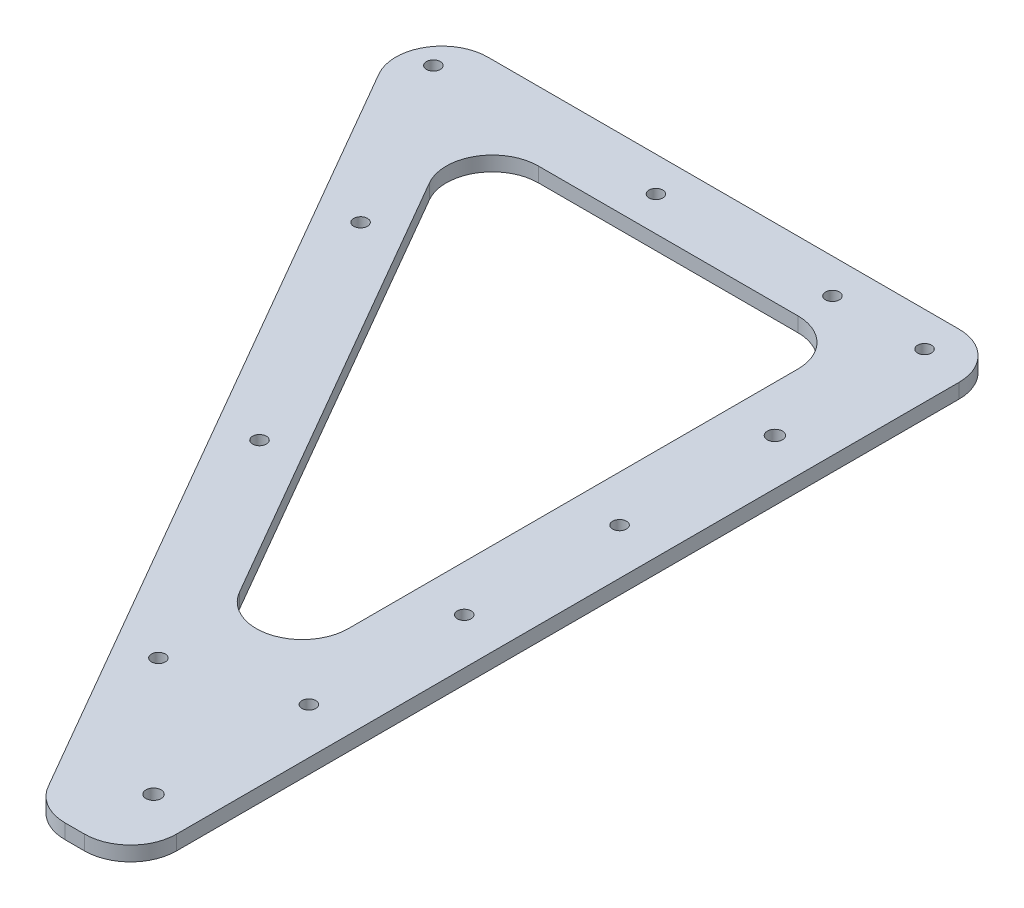
ISO-10303-21;
HEADER;
FILE_DESCRIPTION(('STEP AP214'),'2;1');
FILE_NAME('part.step','',(''),(''),'','','');
FILE_SCHEMA(('AUTOMOTIVE_DESIGN { 1 0 10303 214 1 1 1 1 }'));
ENDSEC;
DATA;
#1=APPLICATION_CONTEXT('core data for automotive mechanical design processes');
#2=APPLICATION_PROTOCOL_DEFINITION('international standard','automotive_design',2000,#1);
#3=PRODUCT_CONTEXT('',#1,'mechanical');
#4=PRODUCT('Part','Part','',(#3));
#5=PRODUCT_RELATED_PRODUCT_CATEGORY('part','',(#4));
#6=PRODUCT_DEFINITION_FORMATION('','',#4);
#7=PRODUCT_DEFINITION_CONTEXT('part definition',#1,'design');
#8=PRODUCT_DEFINITION('design','',#6,#7);
#9=PRODUCT_DEFINITION_SHAPE('','',#8);
#10=(LENGTH_UNIT() NAMED_UNIT(*) SI_UNIT(.MILLI.,.METRE.));
#11=(NAMED_UNIT(*) PLANE_ANGLE_UNIT() SI_UNIT($,.RADIAN.));
#12=(NAMED_UNIT(*) SI_UNIT($,.STERADIAN.) SOLID_ANGLE_UNIT());
#13=UNCERTAINTY_MEASURE_WITH_UNIT(LENGTH_MEASURE(1.E-05),#10,'distance_accuracy_value','');
#14=(GEOMETRIC_REPRESENTATION_CONTEXT(3) GLOBAL_UNCERTAINTY_ASSIGNED_CONTEXT((#13)) GLOBAL_UNIT_ASSIGNED_CONTEXT((#10,
#11,#12)) REPRESENTATION_CONTEXT('',''));
#15=CARTESIAN_POINT('',(0.,0.,0.));
#16=DIRECTION('',(0.,0.,1.));
#17=DIRECTION('',(1.,0.,0.));
#18=AXIS2_PLACEMENT_3D('',#15,#16,#17);
#19=CARTESIAN_POINT('',(-20.,3.175,0.));
#20=DIRECTION('',(1.,0.,0.));
#21=DIRECTION('',(0.,0.,-1.));
#22=AXIS2_PLACEMENT_3D('',#19,#20,#21);
#23=PLANE('',#22);
#24=DIRECTION('',(0.,0.,1.));
#25=VECTOR('',#24,1.);
#26=CARTESIAN_POINT('',(-20.,3.175,0.));
#27=LINE('',#26,#25);
#28=CARTESIAN_POINT('',(-20.,3.175,25.));
#29=VERTEX_POINT('',#28);
#30=CARTESIAN_POINT('',(-20.,3.175,122.679491924311));
#31=VERTEX_POINT('',#30);
#32=EDGE_CURVE('E156',#29,#31,#27,.T.);
#33=ORIENTED_EDGE('',*,*,#32,.F.);
#34=DIRECTION('',(0.,-1.,0.));
#35=VECTOR('',#34,1.);
#36=CARTESIAN_POINT('',(-20.,0.,25.));
#37=LINE('',#36,#35);
#38=CARTESIAN_POINT('',(-20.,0.,25.));
#39=VERTEX_POINT('',#38);
#40=EDGE_CURVE('E141',#29,#39,#37,.T.);
#41=ORIENTED_EDGE('',*,*,#40,.T.);
#42=DIRECTION('',(0.,0.,1.));
#43=VECTOR('',#42,1.);
#44=CARTESIAN_POINT('',(-20.,0.,0.));
#45=LINE('',#44,#43);
#46=CARTESIAN_POINT('',(-20.,0.,122.679491924311));
#47=VERTEX_POINT('',#46);
#48=EDGE_CURVE('E153',#39,#47,#45,.T.);
#49=ORIENTED_EDGE('',*,*,#48,.T.);
#50=DIRECTION('',(0.,-1.,0.));
#51=VECTOR('',#50,1.);
#52=CARTESIAN_POINT('',(-20.,3.175,122.679491924311));
#53=LINE('',#52,#51);
#54=EDGE_CURVE('E158',#47,#31,#53,.F.);
#55=ORIENTED_EDGE('',*,*,#54,.T.);
#56=EDGE_LOOP('',(#33,#41,#49,#55));
#57=FACE_BOUND('',#56,.T.);
#58=ADVANCED_FACE('F35',(#57),#23,.F.);
#59=CARTESIAN_POINT('',(-84.2820323027551,3.175,48.6602540378444));
#60=DIRECTION('',(-0.866025403784439,0.,0.5));
#61=DIRECTION('',(0.5,0.,0.866025403784439));
#62=AXIS2_PLACEMENT_3D('',#59,#60,#61);
#63=PLANE('',#62);
#64=DIRECTION('',(-0.5,0.,-0.866025403784439));
#65=VECTOR('',#64,1.);
#66=CARTESIAN_POINT('',(-84.2820323027551,0.,48.6602540378444));
#67=LINE('',#66,#65);
#68=CARTESIAN_POINT('',(-38.6602540378444,0.,127.679491924311));
#69=VERTEX_POINT('',#68);
#70=CARTESIAN_POINT('',(-95.0555349946513,0.,30.));
#71=VERTEX_POINT('',#70);
#72=EDGE_CURVE('E163',#69,#71,#67,.T.);
#73=ORIENTED_EDGE('',*,*,#72,.T.);
#74=DIRECTION('',(0.,-1.,0.));
#75=VECTOR('',#74,1.);
#76=CARTESIAN_POINT('',(-95.0555349946513,3.175,30.));
#77=LINE('',#76,#75);
#78=CARTESIAN_POINT('',(-95.0555349946513,3.175,30.));
#79=VERTEX_POINT('',#78);
#80=EDGE_CURVE('E202',#71,#79,#77,.F.);
#81=ORIENTED_EDGE('',*,*,#80,.T.);
#82=DIRECTION('',(-0.5,0.,-0.866025403784439));
#83=VECTOR('',#82,1.);
#84=CARTESIAN_POINT('',(-84.2820323027551,3.175,48.6602540378444));
#85=LINE('',#84,#83);
#86=CARTESIAN_POINT('',(-38.6602540378444,3.175,127.679491924311));
#87=VERTEX_POINT('',#86);
#88=EDGE_CURVE('E250',#87,#79,#85,.T.);
#89=ORIENTED_EDGE('',*,*,#88,.F.);
#90=DIRECTION('',(0.,-1.,0.));
#91=VECTOR('',#90,1.);
#92=CARTESIAN_POINT('',(-38.6602540378444,0.,127.679491924311));
#93=LINE('',#92,#91);
#94=EDGE_CURVE('E199',#87,#69,#93,.T.);
#95=ORIENTED_EDGE('',*,*,#94,.T.);
#96=EDGE_LOOP('',(#73,#81,#89,#95));
#97=FACE_BOUND('',#96,.T.);
#98=ADVANCED_FACE('F260',(#97),#63,.F.);
#99=CARTESIAN_POINT('',(-97.2724133595217,3.175,56.1602540378444));
#100=DIRECTION('',(-0.866025403784439,0.,0.5));
#101=DIRECTION('',(0.5,0.,0.866025403784439));
#102=AXIS2_PLACEMENT_3D('',#99,#100,#101);
#103=PLANE('',#102);
#104=DIRECTION('',(-0.5,0.,-0.866025403784439));
#105=VECTOR('',#104,1.);
#106=CARTESIAN_POINT('',(-97.2724133595217,3.175,56.1602540378444));
#107=LINE('',#106,#105);
#108=CARTESIAN_POINT('',(-22.8867513459481,3.175,185.));
#109=VERTEX_POINT('',#108);
#110=CARTESIAN_POINT('',(-121.036297108185,3.175,15.));
#111=VERTEX_POINT('',#110);
#112=EDGE_CURVE('E331',#109,#111,#107,.T.);
#113=ORIENTED_EDGE('',*,*,#112,.T.);
#114=DIRECTION('',(0.,-1.,0.));
#115=VECTOR('',#114,1.);
#116=CARTESIAN_POINT('',(-121.036297108185,0.,15.));
#117=LINE('',#116,#115);
#118=CARTESIAN_POINT('',(-121.036297108185,0.,15.));
#119=VERTEX_POINT('',#118);
#120=EDGE_CURVE('E206',#111,#119,#117,.T.);
#121=ORIENTED_EDGE('',*,*,#120,.T.);
#122=DIRECTION('',(-0.5,0.,-0.866025403784439));
#123=VECTOR('',#122,1.);
#124=CARTESIAN_POINT('',(-97.2724133595217,0.,56.1602540378444));
#125=LINE('',#124,#123);
#126=CARTESIAN_POINT('',(-22.8867513459481,0.,185.));
#127=VERTEX_POINT('',#126);
#128=EDGE_CURVE('E306',#127,#119,#125,.T.);
#129=ORIENTED_EDGE('',*,*,#128,.F.);
#130=DIRECTION('',(0.,-1.,0.));
#131=VECTOR('',#130,1.);
#132=CARTESIAN_POINT('',(-22.8867513459481,3.175,185.));
#133=LINE('',#132,#131);
#134=EDGE_CURVE('E204',#127,#109,#133,.F.);
#135=ORIENTED_EDGE('',*,*,#134,.T.);
#136=EDGE_LOOP('',(#113,#121,#129,#135));
#137=FACE_BOUND('',#136,.T.);
#138=ADVANCED_FACE('F334',(#137),#103,.T.);
#139=CARTESIAN_POINT('',(0.,3.175,190.));
#140=DIRECTION('',(0.,0.,1.));
#141=DIRECTION('',(1.,0.,0.));
#142=AXIS2_PLACEMENT_3D('',#139,#140,#141);
#143=PLANE('',#142);
#144=DIRECTION('',(-1.,0.,0.));
#145=VECTOR('',#144,1.);
#146=CARTESIAN_POINT('',(0.,0.,190.));
#147=LINE('',#146,#145);
#148=CARTESIAN_POINT('',(-9.99999999999998,0.,190.));
#149=VERTEX_POINT('',#148);
#150=CARTESIAN_POINT('',(-14.2264973081037,0.,190.));
#151=VERTEX_POINT('',#150);
#152=EDGE_CURVE('E309',#149,#151,#147,.T.);
#153=ORIENTED_EDGE('',*,*,#152,.F.);
#154=DIRECTION('',(0.,-1.,0.));
#155=VECTOR('',#154,1.);
#156=CARTESIAN_POINT('',(-9.99999999999998,3.175,190.));
#157=LINE('',#156,#155);
#158=CARTESIAN_POINT('',(-9.99999999999998,3.175,190.));
#159=VERTEX_POINT('',#158);
#160=EDGE_CURVE('E148',#149,#159,#157,.F.);
#161=ORIENTED_EDGE('',*,*,#160,.T.);
#162=DIRECTION('',(-1.,0.,0.));
#163=VECTOR('',#162,1.);
#164=CARTESIAN_POINT('',(0.,3.175,190.));
#165=LINE('',#164,#163);
#166=CARTESIAN_POINT('',(-14.2264973081037,3.175,190.));
#167=VERTEX_POINT('',#166);
#168=EDGE_CURVE('E337',#159,#167,#165,.T.);
#169=ORIENTED_EDGE('',*,*,#168,.T.);
#170=DIRECTION('',(0.,-1.,0.));
#171=VECTOR('',#170,1.);
#172=CARTESIAN_POINT('',(-14.2264973081037,3.175,190.));
#173=LINE('',#172,#171);
#174=EDGE_CURVE('E233',#167,#151,#173,.T.);
#175=ORIENTED_EDGE('',*,*,#174,.T.);
#176=EDGE_LOOP('',(#153,#161,#169,#175));
#177=FACE_BOUND('',#176,.T.);
#178=ADVANCED_FACE('F350',(#177),#143,.T.);
#179=CARTESIAN_POINT('',(0.,3.175,0.));
#180=DIRECTION('',(1.,0.,0.));
#181=DIRECTION('',(0.,0.,-1.));
#182=AXIS2_PLACEMENT_3D('',#179,#180,#181);
#183=PLANE('',#182);
#184=DIRECTION('',(0.,0.,1.));
#185=VECTOR('',#184,1.);
#186=CARTESIAN_POINT('',(0.,0.,0.));
#187=LINE('',#186,#185);
#188=CARTESIAN_POINT('',(0.,0.,10.));
#189=VERTEX_POINT('',#188);
#190=CARTESIAN_POINT('',(0.,0.,180.));
#191=VERTEX_POINT('',#190);
#192=EDGE_CURVE('E170',#189,#191,#187,.T.);
#193=ORIENTED_EDGE('',*,*,#192,.F.);
#194=DIRECTION('',(0.,-1.,0.));
#195=VECTOR('',#194,1.);
#196=CARTESIAN_POINT('',(0.,3.175,10.));
#197=LINE('',#196,#195);
#198=CARTESIAN_POINT('',(0.,3.175,10.));
#199=VERTEX_POINT('',#198);
#200=EDGE_CURVE('E57',#189,#199,#197,.F.);
#201=ORIENTED_EDGE('',*,*,#200,.T.);
#202=DIRECTION('',(0.,0.,1.));
#203=VECTOR('',#202,1.);
#204=CARTESIAN_POINT('',(0.,3.175,0.));
#205=LINE('',#204,#203);
#206=CARTESIAN_POINT('',(0.,3.175,180.));
#207=VERTEX_POINT('',#206);
#208=EDGE_CURVE('E268',#199,#207,#205,.T.);
#209=ORIENTED_EDGE('',*,*,#208,.T.);
#210=DIRECTION('',(0.,-1.,0.));
#211=VECTOR('',#210,1.);
#212=CARTESIAN_POINT('',(0.,3.175,180.));
#213=LINE('',#212,#211);
#214=EDGE_CURVE('E229',#207,#191,#213,.T.);
#215=ORIENTED_EDGE('',*,*,#214,.T.);
#216=EDGE_LOOP('',(#193,#201,#209,#215));
#217=FACE_BOUND('',#216,.T.);
#218=ADVANCED_FACE('F315',(#217),#183,.T.);
#219=CARTESIAN_POINT('',(-9.99999999999997,3.175,40.));
#220=DIRECTION('',(0.,-1.,0.));
#221=DIRECTION('',(0.,0.,-1.));
#222=AXIS2_PLACEMENT_3D('',#219,#220,#221);
#223=CYLINDRICAL_SURFACE('',#222,1.65);
#224=CARTESIAN_POINT('',(-9.99999999999997,3.175,40.));
#225=DIRECTION('',(0.,1.,0.));
#226=DIRECTION('',(0.,0.,1.));
#227=AXIS2_PLACEMENT_3D('',#224,#225,#226);
#228=CIRCLE('',#227,1.65);
#229=CARTESIAN_POINT('',(-9.99999999999997,3.175,41.65));
#230=VERTEX_POINT('',#229);
#231=EDGE_CURVE('E283',#230,#230,#228,.T.);
#232=ORIENTED_EDGE('',*,*,#231,.T.);
#233=EDGE_LOOP('',(#232));
#234=FACE_BOUND('',#233,.T.);
#235=CARTESIAN_POINT('',(-9.99999999999997,0.,40.));
#236=DIRECTION('',(0.,1.,0.));
#237=DIRECTION('',(0.,0.,1.));
#238=AXIS2_PLACEMENT_3D('',#235,#236,#237);
#239=CIRCLE('',#238,1.65);
#240=CARTESIAN_POINT('',(-9.99999999999997,0.,41.65));
#241=VERTEX_POINT('',#240);
#242=EDGE_CURVE('E187',#241,#241,#239,.T.);
#243=ORIENTED_EDGE('',*,*,#242,.F.);
#244=EDGE_LOOP('',(#243));
#245=FACE_BOUND('',#244,.T.);
#246=ADVANCED_FACE('F373',(#234,#245),#223,.F.);
#247=CARTESIAN_POINT('',(-10.,3.175,141.25));
#248=DIRECTION('',(0.,-1.,0.));
#249=DIRECTION('',(0.,0.,-1.));
#250=AXIS2_PLACEMENT_3D('',#247,#248,#249);
#251=CYLINDRICAL_SURFACE('',#250,1.5);
#252=CARTESIAN_POINT('',(-10.,3.175,141.25));
#253=DIRECTION('',(0.,1.,0.));
#254=DIRECTION('',(0.,0.,1.));
#255=AXIS2_PLACEMENT_3D('',#252,#253,#254);
#256=CIRCLE('',#255,1.5);
#257=CARTESIAN_POINT('',(-10.,3.175,142.75));
#258=VERTEX_POINT('',#257);
#259=EDGE_CURVE('E280',#258,#258,#256,.T.);
#260=ORIENTED_EDGE('',*,*,#259,.T.);
#261=EDGE_LOOP('',(#260));
#262=FACE_BOUND('',#261,.T.);
#263=CARTESIAN_POINT('',(-10.,0.,141.25));
#264=DIRECTION('',(0.,1.,0.));
#265=DIRECTION('',(0.,0.,1.));
#266=AXIS2_PLACEMENT_3D('',#263,#264,#265);
#267=CIRCLE('',#266,1.5);
#268=CARTESIAN_POINT('',(-10.,0.,142.75));
#269=VERTEX_POINT('',#268);
#270=EDGE_CURVE('E184',#269,#269,#267,.T.);
#271=ORIENTED_EDGE('',*,*,#270,.F.);
#272=EDGE_LOOP('',(#271));
#273=FACE_BOUND('',#272,.T.);
#274=ADVANCED_FACE('F587',(#262,#273),#251,.F.);
#275=CARTESIAN_POINT('',(-9.99999999999997,3.175,107.5));
#276=DIRECTION('',(0.,-1.,0.));
#277=DIRECTION('',(0.,0.,-1.));
#278=AXIS2_PLACEMENT_3D('',#275,#276,#277);
#279=CYLINDRICAL_SURFACE('',#278,1.5);
#280=CARTESIAN_POINT('',(-9.99999999999997,3.175,107.5));
#281=DIRECTION('',(0.,1.,0.));
#282=DIRECTION('',(0.,0.,1.));
#283=AXIS2_PLACEMENT_3D('',#280,#281,#282);
#284=CIRCLE('',#283,1.5);
#285=CARTESIAN_POINT('',(-9.99999999999997,3.175,109.));
#286=VERTEX_POINT('',#285);
#287=EDGE_CURVE('E277',#286,#286,#284,.T.);
#288=ORIENTED_EDGE('',*,*,#287,.T.);
#289=EDGE_LOOP('',(#288));
#290=FACE_BOUND('',#289,.T.);
#291=CARTESIAN_POINT('',(-9.99999999999997,0.,107.5));
#292=DIRECTION('',(0.,1.,0.));
#293=DIRECTION('',(0.,0.,1.));
#294=AXIS2_PLACEMENT_3D('',#291,#292,#293);
#295=CIRCLE('',#294,1.5);
#296=CARTESIAN_POINT('',(-9.99999999999997,0.,109.));
#297=VERTEX_POINT('',#296);
#298=EDGE_CURVE('E181',#297,#297,#295,.T.);
#299=ORIENTED_EDGE('',*,*,#298,.F.);
#300=EDGE_LOOP('',(#299));
#301=FACE_BOUND('',#300,.T.);
#302=ADVANCED_FACE('F577',(#290,#301),#279,.F.);
#303=CARTESIAN_POINT('',(-10.,3.175,73.75));
#304=DIRECTION('',(0.,-1.,0.));
#305=DIRECTION('',(0.,0.,-1.));
#306=AXIS2_PLACEMENT_3D('',#303,#304,#305);
#307=CYLINDRICAL_SURFACE('',#306,1.5);
#308=CARTESIAN_POINT('',(-10.,3.175,73.75));
#309=DIRECTION('',(0.,1.,0.));
#310=DIRECTION('',(0.,0.,1.));
#311=AXIS2_PLACEMENT_3D('',#308,#309,#310);
#312=CIRCLE('',#311,1.5);
#313=CARTESIAN_POINT('',(-10.,3.175,75.25));
#314=VERTEX_POINT('',#313);
#315=EDGE_CURVE('E274',#314,#314,#312,.T.);
#316=ORIENTED_EDGE('',*,*,#315,.T.);
#317=EDGE_LOOP('',(#316));
#318=FACE_BOUND('',#317,.T.);
#319=CARTESIAN_POINT('',(-10.,0.,73.75));
#320=DIRECTION('',(0.,1.,0.));
#321=DIRECTION('',(0.,0.,1.));
#322=AXIS2_PLACEMENT_3D('',#319,#320,#321);
#323=CIRCLE('',#322,1.5);
#324=CARTESIAN_POINT('',(-10.,0.,75.25));
#325=VERTEX_POINT('',#324);
#326=EDGE_CURVE('E178',#325,#325,#323,.T.);
#327=ORIENTED_EDGE('',*,*,#326,.F.);
#328=EDGE_LOOP('',(#327));
#329=FACE_BOUND('',#328,.T.);
#330=ADVANCED_FACE('F567',(#318,#329),#307,.F.);
#331=CARTESIAN_POINT('',(-9.99999999999997,3.175,175.));
#332=DIRECTION('',(0.,-1.,0.));
#333=DIRECTION('',(0.,0.,-1.));
#334=AXIS2_PLACEMENT_3D('',#331,#332,#333);
#335=CYLINDRICAL_SURFACE('',#334,1.65);
#336=CARTESIAN_POINT('',(-9.99999999999997,3.175,175.));
#337=DIRECTION('',(0.,1.,0.));
#338=DIRECTION('',(0.,0.,1.));
#339=AXIS2_PLACEMENT_3D('',#336,#337,#338);
#340=CIRCLE('',#339,1.65);
#341=CARTESIAN_POINT('',(-9.99999999999997,3.175,176.65));
#342=VERTEX_POINT('',#341);
#343=EDGE_CURVE('E256',#342,#342,#340,.T.);
#344=ORIENTED_EDGE('',*,*,#343,.T.);
#345=EDGE_LOOP('',(#344));
#346=FACE_BOUND('',#345,.T.);
#347=CARTESIAN_POINT('',(-9.99999999999997,0.,175.));
#348=DIRECTION('',(0.,1.,0.));
#349=DIRECTION('',(0.,0.,1.));
#350=AXIS2_PLACEMENT_3D('',#347,#348,#349);
#351=CIRCLE('',#350,1.65);
#352=CARTESIAN_POINT('',(-9.99999999999997,0.,176.65));
#353=VERTEX_POINT('',#352);
#354=EDGE_CURVE('E175',#353,#353,#351,.T.);
#355=ORIENTED_EDGE('',*,*,#354,.F.);
#356=EDGE_LOOP('',(#355));
#357=FACE_BOUND('',#356,.T.);
#358=ADVANCED_FACE('F485',(#346,#357),#335,.F.);
#359=CARTESIAN_POINT('',(0.,3.175,15.));
#360=DIRECTION('',(0.,0.,-1.));
#361=DIRECTION('',(-1.,0.,0.));
#362=AXIS2_PLACEMENT_3D('',#359,#360,#361);
#363=PLANE('',#362);
#364=DIRECTION('',(1.,0.,0.));
#365=VECTOR('',#364,1.);
#366=CARTESIAN_POINT('',(0.,0.,15.));
#367=LINE('',#366,#365);
#368=CARTESIAN_POINT('',(-86.3952809568069,0.,15.));
#369=VERTEX_POINT('',#368);
#370=CARTESIAN_POINT('',(-30.,0.,15.));
#371=VERTEX_POINT('',#370);
#372=EDGE_CURVE('E167',#369,#371,#367,.T.);
#373=ORIENTED_EDGE('',*,*,#372,.T.);
#374=DIRECTION('',(0.,-1.,0.));
#375=VECTOR('',#374,1.);
#376=CARTESIAN_POINT('',(-30.,3.175,15.));
#377=LINE('',#376,#375);
#378=CARTESIAN_POINT('',(-30.,3.175,15.));
#379=VERTEX_POINT('',#378);
#380=EDGE_CURVE('E142',#371,#379,#377,.F.);
#381=ORIENTED_EDGE('',*,*,#380,.T.);
#382=DIRECTION('',(1.,0.,0.));
#383=VECTOR('',#382,1.);
#384=CARTESIAN_POINT('',(0.,3.175,15.));
#385=LINE('',#384,#383);
#386=CARTESIAN_POINT('',(-86.3952809568069,3.175,15.));
#387=VERTEX_POINT('',#386);
#388=EDGE_CURVE('E248',#387,#379,#385,.T.);
#389=ORIENTED_EDGE('',*,*,#388,.F.);
#390=DIRECTION('',(0.,-1.,0.));
#391=VECTOR('',#390,1.);
#392=CARTESIAN_POINT('',(-86.3952809568069,0.,15.));
#393=LINE('',#392,#391);
#394=EDGE_CURVE('E157',#387,#369,#393,.T.);
#395=ORIENTED_EDGE('',*,*,#394,.T.);
#396=EDGE_LOOP('',(#373,#381,#389,#395));
#397=FACE_BOUND('',#396,.T.);
#398=ADVANCED_FACE('F255',(#397),#363,.F.);
#399=CARTESIAN_POINT('',(0.,3.175,0.));
#400=DIRECTION('',(0.,0.,1.));
#401=DIRECTION('',(1.,0.,0.));
#402=AXIS2_PLACEMENT_3D('',#399,#400,#401);
#403=PLANE('',#402);
#404=DIRECTION('',(-1.,0.,0.));
#405=VECTOR('',#404,1.);
#406=CARTESIAN_POINT('',(0.,0.,0.));
#407=LINE('',#406,#405);
#408=CARTESIAN_POINT('',(-10.,0.,0.));
#409=VERTEX_POINT('',#408);
#410=CARTESIAN_POINT('',(-112.37604307034,0.,0.));
#411=VERTEX_POINT('',#410);
#412=EDGE_CURVE('E164',#409,#411,#407,.T.);
#413=ORIENTED_EDGE('',*,*,#412,.T.);
#414=DIRECTION('',(0.,-1.,0.));
#415=VECTOR('',#414,1.);
#416=CARTESIAN_POINT('',(-112.37604307034,3.175,0.));
#417=LINE('',#416,#415);
#418=CARTESIAN_POINT('',(-112.37604307034,3.175,0.));
#419=VERTEX_POINT('',#418);
#420=EDGE_CURVE('E220',#411,#419,#417,.F.);
#421=ORIENTED_EDGE('',*,*,#420,.T.);
#422=DIRECTION('',(-1.,0.,0.));
#423=VECTOR('',#422,1.);
#424=CARTESIAN_POINT('',(0.,3.175,0.));
#425=LINE('',#424,#423);
#426=CARTESIAN_POINT('',(-10.,3.175,0.));
#427=VERTEX_POINT('',#426);
#428=EDGE_CURVE('E264',#427,#419,#425,.T.);
#429=ORIENTED_EDGE('',*,*,#428,.F.);
#430=DIRECTION('',(0.,-1.,0.));
#431=VECTOR('',#430,1.);
#432=CARTESIAN_POINT('',(-10.,0.,0.));
#433=LINE('',#432,#431);
#434=EDGE_CURVE('E217',#427,#409,#433,.T.);
#435=ORIENTED_EDGE('',*,*,#434,.T.);
#436=EDGE_LOOP('',(#413,#421,#429,#435));
#437=FACE_BOUND('',#436,.T.);
#438=ADVANCED_FACE('F324',(#437),#403,.F.);
#439=CARTESIAN_POINT('',(-30.,3.175,7.50000000000002));
#440=DIRECTION('',(0.,-1.,0.));
#441=DIRECTION('',(0.,0.,-1.));
#442=AXIS2_PLACEMENT_3D('',#439,#440,#441);
#443=CYLINDRICAL_SURFACE('',#442,1.5);
#444=CARTESIAN_POINT('',(-30.,3.175,7.50000000000002));
#445=DIRECTION('',(0.,1.,0.));
#446=DIRECTION('',(0.,0.,1.));
#447=AXIS2_PLACEMENT_3D('',#444,#445,#446);
#448=CIRCLE('',#447,1.5);
#449=CARTESIAN_POINT('',(-30.,3.175,9.00000000000002));
#450=VERTEX_POINT('',#449);
#451=EDGE_CURVE('E338',#450,#450,#448,.T.);
#452=ORIENTED_EDGE('',*,*,#451,.T.);
#453=EDGE_LOOP('',(#452));
#454=FACE_BOUND('',#453,.T.);
#455=CARTESIAN_POINT('',(-30.,0.,7.50000000000002));
#456=DIRECTION('',(0.,1.,0.));
#457=DIRECTION('',(0.,0.,1.));
#458=AXIS2_PLACEMENT_3D('',#455,#456,#457);
#459=CIRCLE('',#458,1.5);
#460=CARTESIAN_POINT('',(-30.,0.,9.00000000000002));
#461=VERTEX_POINT('',#460);
#462=EDGE_CURVE('E303',#461,#461,#459,.T.);
#463=ORIENTED_EDGE('',*,*,#462,.F.);
#464=EDGE_LOOP('',(#463));
#465=FACE_BOUND('',#464,.T.);
#466=ADVANCED_FACE('F370',(#454,#465),#443,.F.);
#467=CARTESIAN_POINT('',(-68.3530850446312,3.175,7.50000000000002));
#468=DIRECTION('',(0.,-1.,0.));
#469=DIRECTION('',(0.,0.,-1.));
#470=AXIS2_PLACEMENT_3D('',#467,#468,#469);
#471=CYLINDRICAL_SURFACE('',#470,1.5);
#472=CARTESIAN_POINT('',(-68.3530850446312,3.175,7.50000000000002));
#473=DIRECTION('',(0.,1.,0.));
#474=DIRECTION('',(0.,0.,1.));
#475=AXIS2_PLACEMENT_3D('',#472,#473,#474);
#476=CIRCLE('',#475,1.5);
#477=CARTESIAN_POINT('',(-68.3530850446312,3.175,9.00000000000002));
#478=VERTEX_POINT('',#477);
#479=EDGE_CURVE('E343',#478,#478,#476,.T.);
#480=ORIENTED_EDGE('',*,*,#479,.T.);
#481=EDGE_LOOP('',(#480));
#482=FACE_BOUND('',#481,.T.);
#483=CARTESIAN_POINT('',(-68.3530850446312,0.,7.50000000000002));
#484=DIRECTION('',(0.,1.,0.));
#485=DIRECTION('',(0.,0.,1.));
#486=AXIS2_PLACEMENT_3D('',#483,#484,#485);
#487=CIRCLE('',#486,1.5);
#488=CARTESIAN_POINT('',(-68.3530850446312,0.,9.00000000000002));
#489=VERTEX_POINT('',#488);
#490=EDGE_CURVE('E300',#489,#489,#487,.T.);
#491=ORIENTED_EDGE('',*,*,#490,.F.);
#492=EDGE_LOOP('',(#491));
#493=FACE_BOUND('',#492,.T.);
#494=ADVANCED_FACE('F380',(#482,#493),#471,.F.);
#495=CARTESIAN_POINT('',(-116.706170089262,3.175,7.50000000000002));
#496=DIRECTION('',(0.,-1.,0.));
#497=DIRECTION('',(0.,0.,-1.));
#498=AXIS2_PLACEMENT_3D('',#495,#496,#497);
#499=CYLINDRICAL_SURFACE('',#498,1.5);
#500=CARTESIAN_POINT('',(-116.706170089262,3.175,7.50000000000002));
#501=DIRECTION('',(0.,1.,0.));
#502=DIRECTION('',(0.,0.,1.));
#503=AXIS2_PLACEMENT_3D('',#500,#501,#502);
#504=CIRCLE('',#503,1.5);
#505=CARTESIAN_POINT('',(-116.706170089262,3.175,9.00000000000002));
#506=VERTEX_POINT('',#505);
#507=EDGE_CURVE('E669',#506,#506,#504,.T.);
#508=ORIENTED_EDGE('',*,*,#507,.T.);
#509=EDGE_LOOP('',(#508));
#510=FACE_BOUND('',#509,.T.);
#511=CARTESIAN_POINT('',(-116.706170089262,0.,7.50000000000002));
#512=DIRECTION('',(0.,1.,0.));
#513=DIRECTION('',(0.,0.,1.));
#514=AXIS2_PLACEMENT_3D('',#511,#512,#513);
#515=CIRCLE('',#514,1.5);
#516=CARTESIAN_POINT('',(-116.706170089262,0.,9.00000000000002));
#517=VERTEX_POINT('',#516);
#518=EDGE_CURVE('E297',#517,#517,#515,.T.);
#519=ORIENTED_EDGE('',*,*,#518,.F.);
#520=EDGE_LOOP('',(#519));
#521=FACE_BOUND('',#520,.T.);
#522=ADVANCED_FACE('F384',(#510,#521),#499,.F.);
#523=CARTESIAN_POINT('',(-95.1054897804395,3.175,44.9134757729337));
#524=DIRECTION('',(0.,-1.,0.));
#525=DIRECTION('',(0.,0.,-1.));
#526=AXIS2_PLACEMENT_3D('',#523,#524,#525);
#527=CYLINDRICAL_SURFACE('',#526,1.5);
#528=CARTESIAN_POINT('',(-95.1054897804395,3.175,44.9134757729337));
#529=DIRECTION('',(0.,1.,0.));
#530=DIRECTION('',(0.,0.,1.));
#531=AXIS2_PLACEMENT_3D('',#528,#529,#530);
#532=CIRCLE('',#531,1.5);
#533=CARTESIAN_POINT('',(-95.1054897804395,3.175,46.4134757729337));
#534=VERTEX_POINT('',#533);
#535=EDGE_CURVE('E665',#534,#534,#532,.T.);
#536=ORIENTED_EDGE('',*,*,#535,.T.);
#537=EDGE_LOOP('',(#536));
#538=FACE_BOUND('',#537,.T.);
#539=CARTESIAN_POINT('',(-95.1054897804395,0.,44.9134757729337));
#540=DIRECTION('',(0.,1.,0.));
#541=DIRECTION('',(0.,0.,1.));
#542=AXIS2_PLACEMENT_3D('',#539,#540,#541);
#543=CIRCLE('',#542,1.5);
#544=CARTESIAN_POINT('',(-95.1054897804395,0.,46.4134757729337));
#545=VERTEX_POINT('',#544);
#546=EDGE_CURVE('E294',#545,#545,#543,.T.);
#547=ORIENTED_EDGE('',*,*,#546,.F.);
#548=EDGE_LOOP('',(#547));
#549=FACE_BOUND('',#548,.T.);
#550=ADVANCED_FACE('F388',(#538,#549),#527,.F.);
#551=CARTESIAN_POINT('',(-65.1054897804395,3.175,96.875));
#552=DIRECTION('',(0.,-1.,0.));
#553=DIRECTION('',(0.,0.,-1.));
#554=AXIS2_PLACEMENT_3D('',#551,#552,#553);
#555=CYLINDRICAL_SURFACE('',#554,1.5);
#556=CARTESIAN_POINT('',(-65.1054897804395,3.175,96.875));
#557=DIRECTION('',(0.,1.,0.));
#558=DIRECTION('',(0.,0.,1.));
#559=AXIS2_PLACEMENT_3D('',#556,#557,#558);
#560=CIRCLE('',#559,1.5);
#561=CARTESIAN_POINT('',(-65.1054897804395,3.175,98.375));
#562=VERTEX_POINT('',#561);
#563=EDGE_CURVE('E661',#562,#562,#560,.T.);
#564=ORIENTED_EDGE('',*,*,#563,.T.);
#565=EDGE_LOOP('',(#564));
#566=FACE_BOUND('',#565,.T.);
#567=CARTESIAN_POINT('',(-65.1054897804395,0.,96.875));
#568=DIRECTION('',(0.,1.,0.));
#569=DIRECTION('',(0.,0.,1.));
#570=AXIS2_PLACEMENT_3D('',#567,#568,#569);
#571=CIRCLE('',#570,1.5);
#572=CARTESIAN_POINT('',(-65.1054897804395,0.,98.375));
#573=VERTEX_POINT('',#572);
#574=EDGE_CURVE('E291',#573,#573,#571,.T.);
#575=ORIENTED_EDGE('',*,*,#574,.F.);
#576=EDGE_LOOP('',(#575));
#577=FACE_BOUND('',#576,.T.);
#578=ADVANCED_FACE('F392',(#566,#577),#555,.F.);
#579=CARTESIAN_POINT('',(-35.1054897804395,3.175,148.836524227066));
#580=DIRECTION('',(0.,-1.,0.));
#581=DIRECTION('',(0.,0.,-1.));
#582=AXIS2_PLACEMENT_3D('',#579,#580,#581);
#583=CYLINDRICAL_SURFACE('',#582,1.5);
#584=CARTESIAN_POINT('',(-35.1054897804395,3.175,148.836524227066));
#585=DIRECTION('',(0.,1.,0.));
#586=DIRECTION('',(0.,0.,1.));
#587=AXIS2_PLACEMENT_3D('',#584,#585,#586);
#588=CIRCLE('',#587,1.5);
#589=CARTESIAN_POINT('',(-35.1054897804395,3.175,150.336524227066));
#590=VERTEX_POINT('',#589);
#591=EDGE_CURVE('E193',#590,#590,#588,.T.);
#592=ORIENTED_EDGE('',*,*,#591,.T.);
#593=EDGE_LOOP('',(#592));
#594=FACE_BOUND('',#593,.T.);
#595=CARTESIAN_POINT('',(-35.1054897804395,0.,148.836524227066));
#596=DIRECTION('',(0.,1.,0.));
#597=DIRECTION('',(0.,0.,1.));
#598=AXIS2_PLACEMENT_3D('',#595,#596,#597);
#599=CIRCLE('',#598,1.5);
#600=CARTESIAN_POINT('',(-35.1054897804395,0.,150.336524227066));
#601=VERTEX_POINT('',#600);
#602=EDGE_CURVE('E288',#601,#601,#599,.T.);
#603=ORIENTED_EDGE('',*,*,#602,.F.);
#604=EDGE_LOOP('',(#603));
#605=FACE_BOUND('',#604,.T.);
#606=ADVANCED_FACE('F396',(#594,#605),#583,.F.);
#607=CARTESIAN_POINT('',(-9.99999999999997,3.175,7.50000000000002));
#608=DIRECTION('',(0.,-1.,0.));
#609=DIRECTION('',(0.,0.,-1.));
#610=AXIS2_PLACEMENT_3D('',#607,#608,#609);
#611=CYLINDRICAL_SURFACE('',#610,1.5);
#612=CARTESIAN_POINT('',(-9.99999999999997,3.175,7.50000000000002));
#613=DIRECTION('',(0.,1.,0.));
#614=DIRECTION('',(0.,0.,1.));
#615=AXIS2_PLACEMENT_3D('',#612,#613,#614);
#616=CIRCLE('',#615,1.5);
#617=CARTESIAN_POINT('',(-9.99999999999997,3.175,9.00000000000002));
#618=VERTEX_POINT('',#617);
#619=EDGE_CURVE('E194',#618,#618,#616,.T.);
#620=ORIENTED_EDGE('',*,*,#619,.T.);
#621=EDGE_LOOP('',(#620));
#622=FACE_BOUND('',#621,.T.);
#623=CARTESIAN_POINT('',(-9.99999999999997,0.,7.50000000000002));
#624=DIRECTION('',(0.,1.,0.));
#625=DIRECTION('',(0.,0.,1.));
#626=AXIS2_PLACEMENT_3D('',#623,#624,#625);
#627=CIRCLE('',#626,1.5);
#628=CARTESIAN_POINT('',(-9.99999999999997,0.,9.00000000000002));
#629=VERTEX_POINT('',#628);
#630=EDGE_CURVE('E190',#629,#629,#627,.T.);
#631=ORIENTED_EDGE('',*,*,#630,.F.);
#632=EDGE_LOOP('',(#631));
#633=FACE_BOUND('',#632,.T.);
#634=ADVANCED_FACE('F400',(#622,#633),#611,.F.);
#635=CARTESIAN_POINT('',(0.,3.175,0.));
#636=DIRECTION('',(0.,1.,0.));
#637=DIRECTION('',(0.,0.,1.));
#638=AXIS2_PLACEMENT_3D('',#635,#636,#637);
#639=PLANE('',#638);
#640=ORIENTED_EDGE('',*,*,#591,.F.);
#641=EDGE_LOOP('',(#640));
#642=FACE_BOUND('',#641,.T.);
#643=ORIENTED_EDGE('',*,*,#563,.F.);
#644=EDGE_LOOP('',(#643));
#645=FACE_BOUND('',#644,.T.);
#646=ORIENTED_EDGE('',*,*,#535,.F.);
#647=EDGE_LOOP('',(#646));
#648=FACE_BOUND('',#647,.T.);
#649=ORIENTED_EDGE('',*,*,#507,.F.);
#650=EDGE_LOOP('',(#649));
#651=FACE_BOUND('',#650,.T.);
#652=ORIENTED_EDGE('',*,*,#479,.F.);
#653=EDGE_LOOP('',(#652));
#654=FACE_BOUND('',#653,.T.);
#655=ORIENTED_EDGE('',*,*,#451,.F.);
#656=EDGE_LOOP('',(#655));
#657=FACE_BOUND('',#656,.T.);
#658=ORIENTED_EDGE('',*,*,#428,.T.);
#659=CARTESIAN_POINT('',(-112.37604307034,3.175,10.));
#660=DIRECTION('',(0.,1.,0.));
#661=DIRECTION('',(0.,0.,1.));
#662=AXIS2_PLACEMENT_3D('',#659,#660,#661);
#663=CIRCLE('',#662,10.);
#664=EDGE_CURVE('E227',#419,#111,#663,.T.);
#665=ORIENTED_EDGE('',*,*,#664,.T.);
#666=ORIENTED_EDGE('',*,*,#112,.F.);
#667=CARTESIAN_POINT('',(-14.2264973081037,3.175,180.));
#668=DIRECTION('',(0.,1.,0.));
#669=DIRECTION('',(0.,0.,1.));
#670=AXIS2_PLACEMENT_3D('',#667,#668,#669);
#671=CIRCLE('',#670,10.);
#672=EDGE_CURVE('E222',#109,#167,#671,.T.);
#673=ORIENTED_EDGE('',*,*,#672,.T.);
#674=ORIENTED_EDGE('',*,*,#168,.F.);
#675=CARTESIAN_POINT('',(-9.99999999999998,3.175,180.));
#676=DIRECTION('',(0.,1.,0.));
#677=DIRECTION('',(0.,0.,1.));
#678=AXIS2_PLACEMENT_3D('',#675,#676,#677);
#679=CIRCLE('',#678,10.);
#680=EDGE_CURVE('E50',#159,#207,#679,.T.);
#681=ORIENTED_EDGE('',*,*,#680,.T.);
#682=ORIENTED_EDGE('',*,*,#208,.F.);
#683=CARTESIAN_POINT('',(-10.,3.175,10.));
#684=DIRECTION('',(0.,1.,0.));
#685=DIRECTION('',(0.,0.,1.));
#686=AXIS2_PLACEMENT_3D('',#683,#684,#685);
#687=CIRCLE('',#686,10.);
#688=EDGE_CURVE('E225',#199,#427,#687,.T.);
#689=ORIENTED_EDGE('',*,*,#688,.T.);
#690=EDGE_LOOP('',(#658,#665,#666,#673,#674,#681,#682,#689));
#691=FACE_BOUND('',#690,.T.);
#692=ORIENTED_EDGE('',*,*,#388,.T.);
#693=CARTESIAN_POINT('',(-30.,3.175,25.));
#694=DIRECTION('',(0.,1.,0.));
#695=DIRECTION('',(0.,0.,1.));
#696=AXIS2_PLACEMENT_3D('',#693,#694,#695);
#697=CIRCLE('',#696,10.);
#698=EDGE_CURVE('E147',#379,#29,#697,.F.);
#699=ORIENTED_EDGE('',*,*,#698,.T.);
#700=ORIENTED_EDGE('',*,*,#32,.T.);
#701=CARTESIAN_POINT('',(-30.,3.175,122.679491924311));
#702=DIRECTION('',(0.,1.,0.));
#703=DIRECTION('',(0.,0.,1.));
#704=AXIS2_PLACEMENT_3D('',#701,#702,#703);
#705=CIRCLE('',#704,10.);
#706=EDGE_CURVE('E11',#31,#87,#705,.F.);
#707=ORIENTED_EDGE('',*,*,#706,.T.);
#708=ORIENTED_EDGE('',*,*,#88,.T.);
#709=CARTESIAN_POINT('',(-86.3952809568069,3.175,25.));
#710=DIRECTION('',(0.,1.,0.));
#711=DIRECTION('',(0.,0.,1.));
#712=AXIS2_PLACEMENT_3D('',#709,#710,#711);
#713=CIRCLE('',#712,10.);
#714=EDGE_CURVE('E240',#79,#387,#713,.F.);
#715=ORIENTED_EDGE('',*,*,#714,.T.);
#716=EDGE_LOOP('',(#692,#699,#700,#707,#708,#715));
#717=FACE_BOUND('',#716,.T.);
#718=ORIENTED_EDGE('',*,*,#343,.F.);
#719=EDGE_LOOP('',(#718));
#720=FACE_BOUND('',#719,.T.);
#721=ORIENTED_EDGE('',*,*,#315,.F.);
#722=EDGE_LOOP('',(#721));
#723=FACE_BOUND('',#722,.T.);
#724=ORIENTED_EDGE('',*,*,#287,.F.);
#725=EDGE_LOOP('',(#724));
#726=FACE_BOUND('',#725,.T.);
#727=ORIENTED_EDGE('',*,*,#259,.F.);
#728=EDGE_LOOP('',(#727));
#729=FACE_BOUND('',#728,.T.);
#730=ORIENTED_EDGE('',*,*,#231,.F.);
#731=EDGE_LOOP('',(#730));
#732=FACE_BOUND('',#731,.T.);
#733=ORIENTED_EDGE('',*,*,#619,.F.);
#734=EDGE_LOOP('',(#733));
#735=FACE_BOUND('',#734,.T.);
#736=ADVANCED_FACE('F246',(#642,#645,#648,#651,#654,#657,#691,#717,#720,#723,#726,#729,#732,
#735),#639,.T.);
#737=CARTESIAN_POINT('',(0.,0.,0.));
#738=DIRECTION('',(0.,1.,0.));
#739=DIRECTION('',(0.,0.,1.));
#740=AXIS2_PLACEMENT_3D('',#737,#738,#739);
#741=PLANE('',#740);
#742=ORIENTED_EDGE('',*,*,#602,.T.);
#743=EDGE_LOOP('',(#742));
#744=FACE_BOUND('',#743,.T.);
#745=ORIENTED_EDGE('',*,*,#574,.T.);
#746=EDGE_LOOP('',(#745));
#747=FACE_BOUND('',#746,.T.);
#748=ORIENTED_EDGE('',*,*,#546,.T.);
#749=EDGE_LOOP('',(#748));
#750=FACE_BOUND('',#749,.T.);
#751=ORIENTED_EDGE('',*,*,#518,.T.);
#752=EDGE_LOOP('',(#751));
#753=FACE_BOUND('',#752,.T.);
#754=ORIENTED_EDGE('',*,*,#490,.T.);
#755=EDGE_LOOP('',(#754));
#756=FACE_BOUND('',#755,.T.);
#757=ORIENTED_EDGE('',*,*,#462,.T.);
#758=EDGE_LOOP('',(#757));
#759=FACE_BOUND('',#758,.T.);
#760=ORIENTED_EDGE('',*,*,#128,.T.);
#761=CARTESIAN_POINT('',(-112.37604307034,0.,10.));
#762=DIRECTION('',(0.,1.,0.));
#763=DIRECTION('',(0.,0.,1.));
#764=AXIS2_PLACEMENT_3D('',#761,#762,#763);
#765=CIRCLE('',#764,10.);
#766=EDGE_CURVE('E215',#119,#411,#765,.F.);
#767=ORIENTED_EDGE('',*,*,#766,.T.);
#768=ORIENTED_EDGE('',*,*,#412,.F.);
#769=CARTESIAN_POINT('',(-10.,0.,10.));
#770=DIRECTION('',(0.,1.,0.));
#771=DIRECTION('',(0.,0.,1.));
#772=AXIS2_PLACEMENT_3D('',#769,#770,#771);
#773=CIRCLE('',#772,10.);
#774=EDGE_CURVE('E213',#409,#189,#773,.F.);
#775=ORIENTED_EDGE('',*,*,#774,.T.);
#776=ORIENTED_EDGE('',*,*,#192,.T.);
#777=CARTESIAN_POINT('',(-9.99999999999998,0.,180.));
#778=DIRECTION('',(0.,1.,0.));
#779=DIRECTION('',(0.,0.,1.));
#780=AXIS2_PLACEMENT_3D('',#777,#778,#779);
#781=CIRCLE('',#780,10.);
#782=EDGE_CURVE('E211',#191,#149,#781,.F.);
#783=ORIENTED_EDGE('',*,*,#782,.T.);
#784=ORIENTED_EDGE('',*,*,#152,.T.);
#785=CARTESIAN_POINT('',(-14.2264973081037,0.,180.));
#786=DIRECTION('',(0.,1.,0.));
#787=DIRECTION('',(0.,0.,1.));
#788=AXIS2_PLACEMENT_3D('',#785,#786,#787);
#789=CIRCLE('',#788,10.);
#790=EDGE_CURVE('E209',#151,#127,#789,.F.);
#791=ORIENTED_EDGE('',*,*,#790,.T.);
#792=EDGE_LOOP('',(#760,#767,#768,#775,#776,#783,#784,#791));
#793=FACE_BOUND('',#792,.T.);
#794=ORIENTED_EDGE('',*,*,#48,.F.);
#795=CARTESIAN_POINT('',(-30.,0.,25.));
#796=DIRECTION('',(0.,1.,0.));
#797=DIRECTION('',(0.,0.,1.));
#798=AXIS2_PLACEMENT_3D('',#795,#796,#797);
#799=CIRCLE('',#798,10.);
#800=EDGE_CURVE('E137',#39,#371,#799,.T.);
#801=ORIENTED_EDGE('',*,*,#800,.T.);
#802=ORIENTED_EDGE('',*,*,#372,.F.);
#803=CARTESIAN_POINT('',(-86.3952809568069,0.,25.));
#804=DIRECTION('',(0.,1.,0.));
#805=DIRECTION('',(0.,0.,1.));
#806=AXIS2_PLACEMENT_3D('',#803,#804,#805);
#807=CIRCLE('',#806,10.);
#808=EDGE_CURVE('E238',#369,#71,#807,.T.);
#809=ORIENTED_EDGE('',*,*,#808,.T.);
#810=ORIENTED_EDGE('',*,*,#72,.F.);
#811=CARTESIAN_POINT('',(-30.,0.,122.679491924311));
#812=DIRECTION('',(0.,1.,0.));
#813=DIRECTION('',(0.,0.,1.));
#814=AXIS2_PLACEMENT_3D('',#811,#812,#813);
#815=CIRCLE('',#814,10.);
#816=EDGE_CURVE('E43',#69,#47,#815,.T.);
#817=ORIENTED_EDGE('',*,*,#816,.T.);
#818=EDGE_LOOP('',(#794,#801,#802,#809,#810,#817));
#819=FACE_BOUND('',#818,.T.);
#820=ORIENTED_EDGE('',*,*,#354,.T.);
#821=EDGE_LOOP('',(#820));
#822=FACE_BOUND('',#821,.T.);
#823=ORIENTED_EDGE('',*,*,#326,.T.);
#824=EDGE_LOOP('',(#823));
#825=FACE_BOUND('',#824,.T.);
#826=ORIENTED_EDGE('',*,*,#298,.T.);
#827=EDGE_LOOP('',(#826));
#828=FACE_BOUND('',#827,.T.);
#829=ORIENTED_EDGE('',*,*,#270,.T.);
#830=EDGE_LOOP('',(#829));
#831=FACE_BOUND('',#830,.T.);
#832=ORIENTED_EDGE('',*,*,#242,.T.);
#833=EDGE_LOOP('',(#832));
#834=FACE_BOUND('',#833,.T.);
#835=ORIENTED_EDGE('',*,*,#630,.T.);
#836=EDGE_LOOP('',(#835));
#837=FACE_BOUND('',#836,.T.);
#838=ADVANCED_FACE('F160',(#744,#747,#750,#753,#756,#759,#793,#819,#822,#825,#828,#831,#834,
#837),#741,.F.);
#839=CARTESIAN_POINT('',(-30.,3.175,25.));
#840=DIRECTION('',(0.,1.,0.));
#841=DIRECTION('',(0.,0.,1.));
#842=AXIS2_PLACEMENT_3D('',#839,#840,#841);
#843=CYLINDRICAL_SURFACE('',#842,10.);
#844=ORIENTED_EDGE('',*,*,#698,.F.);
#845=ORIENTED_EDGE('',*,*,#380,.F.);
#846=ORIENTED_EDGE('',*,*,#800,.F.);
#847=ORIENTED_EDGE('',*,*,#40,.F.);
#848=EDGE_LOOP('',(#844,#845,#846,#847));
#849=FACE_BOUND('',#848,.T.);
#850=ADVANCED_FACE('F140',(#849),#843,.F.);
#851=CARTESIAN_POINT('',(-86.3952809568069,3.175,25.));
#852=DIRECTION('',(0.,1.,0.));
#853=DIRECTION('',(0.,0.,1.));
#854=AXIS2_PLACEMENT_3D('',#851,#852,#853);
#855=CYLINDRICAL_SURFACE('',#854,10.);
#856=ORIENTED_EDGE('',*,*,#714,.F.);
#857=ORIENTED_EDGE('',*,*,#80,.F.);
#858=ORIENTED_EDGE('',*,*,#808,.F.);
#859=ORIENTED_EDGE('',*,*,#394,.F.);
#860=EDGE_LOOP('',(#856,#857,#858,#859));
#861=FACE_BOUND('',#860,.T.);
#862=ADVANCED_FACE('F258',(#861),#855,.F.);
#863=CARTESIAN_POINT('',(-112.37604307034,3.175,10.));
#864=DIRECTION('',(0.,1.,0.));
#865=DIRECTION('',(0.,0.,1.));
#866=AXIS2_PLACEMENT_3D('',#863,#864,#865);
#867=CYLINDRICAL_SURFACE('',#866,10.);
#868=ORIENTED_EDGE('',*,*,#664,.F.);
#869=ORIENTED_EDGE('',*,*,#420,.F.);
#870=ORIENTED_EDGE('',*,*,#766,.F.);
#871=ORIENTED_EDGE('',*,*,#120,.F.);
#872=EDGE_LOOP('',(#868,#869,#870,#871));
#873=FACE_BOUND('',#872,.T.);
#874=ADVANCED_FACE('F327',(#873),#867,.T.);
#875=CARTESIAN_POINT('',(-10.,3.175,10.));
#876=DIRECTION('',(0.,1.,0.));
#877=DIRECTION('',(0.,0.,1.));
#878=AXIS2_PLACEMENT_3D('',#875,#876,#877);
#879=CYLINDRICAL_SURFACE('',#878,10.);
#880=ORIENTED_EDGE('',*,*,#688,.F.);
#881=ORIENTED_EDGE('',*,*,#200,.F.);
#882=ORIENTED_EDGE('',*,*,#774,.F.);
#883=ORIENTED_EDGE('',*,*,#434,.F.);
#884=EDGE_LOOP('',(#880,#881,#882,#883));
#885=FACE_BOUND('',#884,.T.);
#886=ADVANCED_FACE('F319',(#885),#879,.T.);
#887=CARTESIAN_POINT('',(-9.99999999999998,3.175,180.));
#888=DIRECTION('',(0.,-1.,0.));
#889=DIRECTION('',(0.,0.,-1.));
#890=AXIS2_PLACEMENT_3D('',#887,#888,#889);
#891=CYLINDRICAL_SURFACE('',#890,10.);
#892=ORIENTED_EDGE('',*,*,#680,.F.);
#893=ORIENTED_EDGE('',*,*,#160,.F.);
#894=ORIENTED_EDGE('',*,*,#782,.F.);
#895=ORIENTED_EDGE('',*,*,#214,.F.);
#896=EDGE_LOOP('',(#892,#893,#894,#895));
#897=FACE_BOUND('',#896,.T.);
#898=ADVANCED_FACE('F347',(#897),#891,.T.);
#899=CARTESIAN_POINT('',(-14.2264973081037,3.175,180.));
#900=DIRECTION('',(0.,-1.,0.));
#901=DIRECTION('',(0.,0.,-1.));
#902=AXIS2_PLACEMENT_3D('',#899,#900,#901);
#903=CYLINDRICAL_SURFACE('',#902,10.);
#904=ORIENTED_EDGE('',*,*,#672,.F.);
#905=ORIENTED_EDGE('',*,*,#134,.F.);
#906=ORIENTED_EDGE('',*,*,#790,.F.);
#907=ORIENTED_EDGE('',*,*,#174,.F.);
#908=EDGE_LOOP('',(#904,#905,#906,#907));
#909=FACE_BOUND('',#908,.T.);
#910=ADVANCED_FACE('F353',(#909),#903,.T.);
#911=CARTESIAN_POINT('',(-30.,3.175,122.679491924311));
#912=DIRECTION('',(0.,1.,0.));
#913=DIRECTION('',(0.,0.,1.));
#914=AXIS2_PLACEMENT_3D('',#911,#912,#913);
#915=CYLINDRICAL_SURFACE('',#914,10.);
#916=ORIENTED_EDGE('',*,*,#706,.F.);
#917=ORIENTED_EDGE('',*,*,#54,.F.);
#918=ORIENTED_EDGE('',*,*,#816,.F.);
#919=ORIENTED_EDGE('',*,*,#94,.F.);
#920=EDGE_LOOP('',(#916,#917,#918,#919));
#921=FACE_BOUND('',#920,.T.);
#922=ADVANCED_FACE('F37',(#921),#915,.F.);
#923=CLOSED_SHELL('',(#58,#98,#138,#178,#218,#246,#274,#302,#330,#358,#398,#438,#466,#494,#522,
#550,#578,#606,#634,#736,#838,#850,#862,#874,#886,#898,#910,#922));
#924=MANIFOLD_SOLID_BREP('B2',#923);
#925=ADVANCED_BREP_SHAPE_REPRESENTATION('',(#18,#924),#14);
#926=SHAPE_DEFINITION_REPRESENTATION(#9,#925);
ENDSEC;
END-ISO-10303-21;
